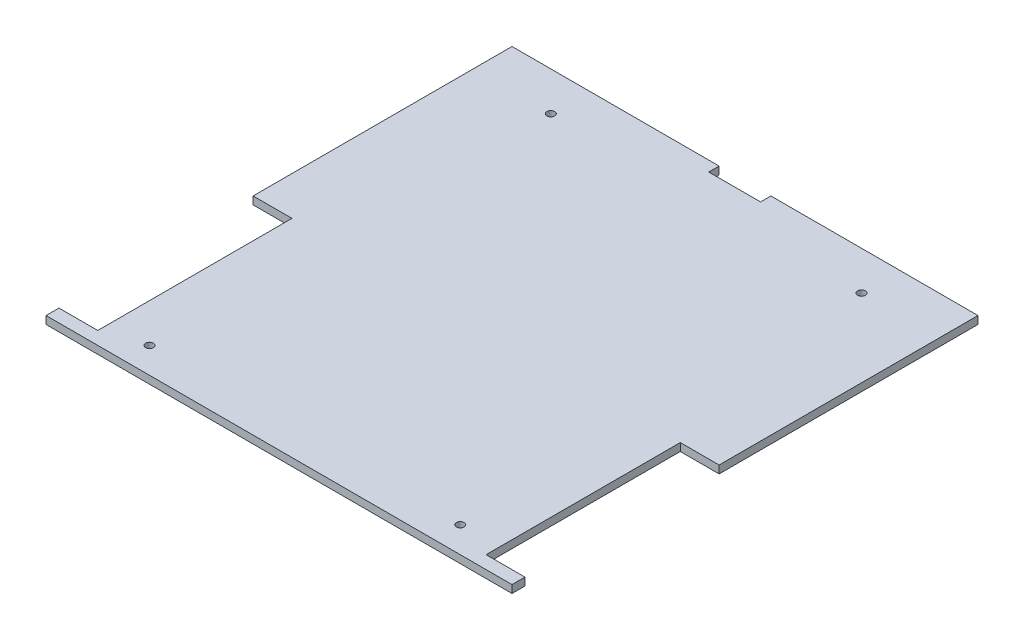
ISO-10303-21;
HEADER;
FILE_DESCRIPTION(('STEP AP214'),'2;1');
FILE_NAME('part.step','',(''),(''),'','','');
FILE_SCHEMA(('AUTOMOTIVE_DESIGN { 1 0 10303 214 1 1 1 1 }'));
ENDSEC;
DATA;
#1=APPLICATION_CONTEXT('core data for automotive mechanical design processes');
#2=APPLICATION_PROTOCOL_DEFINITION('international standard','automotive_design',2000,#1);
#3=PRODUCT_CONTEXT('',#1,'mechanical');
#4=PRODUCT('Part','Part','',(#3));
#5=PRODUCT_RELATED_PRODUCT_CATEGORY('part','',(#4));
#6=PRODUCT_DEFINITION_FORMATION('','',#4);
#7=PRODUCT_DEFINITION_CONTEXT('part definition',#1,'design');
#8=PRODUCT_DEFINITION('design','',#6,#7);
#9=PRODUCT_DEFINITION_SHAPE('','',#8);
#10=(LENGTH_UNIT() NAMED_UNIT(*) SI_UNIT(.MILLI.,.METRE.));
#11=(NAMED_UNIT(*) PLANE_ANGLE_UNIT() SI_UNIT($,.RADIAN.));
#12=(NAMED_UNIT(*) SI_UNIT($,.STERADIAN.) SOLID_ANGLE_UNIT());
#13=UNCERTAINTY_MEASURE_WITH_UNIT(LENGTH_MEASURE(1.E-05),#10,'distance_accuracy_value','');
#14=(GEOMETRIC_REPRESENTATION_CONTEXT(3) GLOBAL_UNCERTAINTY_ASSIGNED_CONTEXT((#13)) GLOBAL_UNIT_ASSIGNED_CONTEXT((#10,
#11,#12)) REPRESENTATION_CONTEXT('',''));
#15=CARTESIAN_POINT('',(0.,0.,0.));
#16=DIRECTION('',(0.,0.,1.));
#17=DIRECTION('',(1.,0.,0.));
#18=AXIS2_PLACEMENT_3D('',#15,#16,#17);
#19=CARTESIAN_POINT('',(-90.,3.,-89.9999999999999));
#20=DIRECTION('',(0.,0.,1.));
#21=DIRECTION('',(1.,0.,0.));
#22=AXIS2_PLACEMENT_3D('',#19,#20,#21);
#23=PLANE('',#22);
#24=DIRECTION('',(-1.,0.,0.));
#25=VECTOR('',#24,1.);
#26=CARTESIAN_POINT('',(-90.,3.,-89.9999999999999));
#27=LINE('',#26,#25);
#28=CARTESIAN_POINT('',(-9.99999999999999,3.,-89.9999999999999));
#29=VERTEX_POINT('',#28);
#30=CARTESIAN_POINT('',(-90.,3.,-89.9999999999999));
#31=VERTEX_POINT('',#30);
#32=EDGE_CURVE('E252',#29,#31,#27,.T.);
#33=ORIENTED_EDGE('',*,*,#32,.F.);
#34=DIRECTION('',(0.,1.,0.));
#35=VECTOR('',#34,1.);
#36=CARTESIAN_POINT('',(-9.99999999999999,-7.,-89.9999999999999));
#37=LINE('',#36,#35);
#38=CARTESIAN_POINT('',(-9.99999999999999,0.,-89.9999999999999));
#39=VERTEX_POINT('',#38);
#40=EDGE_CURVE('E159',#39,#29,#37,.T.);
#41=ORIENTED_EDGE('',*,*,#40,.F.);
#42=DIRECTION('',(-1.,0.,0.));
#43=VECTOR('',#42,1.);
#44=CARTESIAN_POINT('',(-90.,0.,-89.9999999999999));
#45=LINE('',#44,#43);
#46=CARTESIAN_POINT('',(-90.,0.,-89.9999999999999));
#47=VERTEX_POINT('',#46);
#48=EDGE_CURVE('E266',#39,#47,#45,.T.);
#49=ORIENTED_EDGE('',*,*,#48,.T.);
#50=DIRECTION('',(0.,-1.,0.));
#51=VECTOR('',#50,1.);
#52=CARTESIAN_POINT('',(-90.,3.,-89.9999999999999));
#53=LINE('',#52,#51);
#54=EDGE_CURVE('E281',#31,#47,#53,.T.);
#55=ORIENTED_EDGE('',*,*,#54,.F.);
#56=EDGE_LOOP('',(#33,#41,#49,#55));
#57=FACE_BOUND('',#56,.T.);
#58=ADVANCED_FACE('F33',(#57),#23,.F.);
#59=CARTESIAN_POINT('',(90.,3.,-89.9999999999999));
#60=DIRECTION('',(-1.,0.,0.));
#61=DIRECTION('',(0.,0.,1.));
#62=AXIS2_PLACEMENT_3D('',#59,#60,#61);
#63=PLANE('',#62);
#64=DIRECTION('',(0.,0.,-1.));
#65=VECTOR('',#64,1.);
#66=CARTESIAN_POINT('',(90.,0.,-89.9999999999999));
#67=LINE('',#66,#65);
#68=CARTESIAN_POINT('',(90.,0.,90.));
#69=VERTEX_POINT('',#68);
#70=CARTESIAN_POINT('',(90.,0.,85.));
#71=VERTEX_POINT('',#70);
#72=EDGE_CURVE('E263',#69,#71,#67,.T.);
#73=ORIENTED_EDGE('',*,*,#72,.T.);
#74=DIRECTION('',(0.,1.,0.));
#75=VECTOR('',#74,1.);
#76=CARTESIAN_POINT('',(90.,0.,85.));
#77=LINE('',#76,#75);
#78=CARTESIAN_POINT('',(90.,3.,85.));
#79=VERTEX_POINT('',#78);
#80=EDGE_CURVE('E212',#71,#79,#77,.T.);
#81=ORIENTED_EDGE('',*,*,#80,.T.);
#82=DIRECTION('',(0.,0.,-1.));
#83=VECTOR('',#82,1.);
#84=CARTESIAN_POINT('',(90.,3.,-89.9999999999999));
#85=LINE('',#84,#83);
#86=CARTESIAN_POINT('',(90.,3.,90.));
#87=VERTEX_POINT('',#86);
#88=EDGE_CURVE('E249',#87,#79,#85,.T.);
#89=ORIENTED_EDGE('',*,*,#88,.F.);
#90=DIRECTION('',(0.,-1.,0.));
#91=VECTOR('',#90,1.);
#92=CARTESIAN_POINT('',(90.,3.,90.));
#93=LINE('',#92,#91);
#94=EDGE_CURVE('E262',#87,#69,#93,.T.);
#95=ORIENTED_EDGE('',*,*,#94,.T.);
#96=EDGE_LOOP('',(#73,#81,#89,#95));
#97=FACE_BOUND('',#96,.T.);
#98=ADVANCED_FACE('F316',(#97),#63,.F.);
#99=CARTESIAN_POINT('',(-90.,3.,-89.9999999999999));
#100=DIRECTION('',(1.,0.,0.));
#101=DIRECTION('',(0.,0.,-1.));
#102=AXIS2_PLACEMENT_3D('',#99,#100,#101);
#103=PLANE('',#102);
#104=DIRECTION('',(0.,0.,1.));
#105=VECTOR('',#104,1.);
#106=CARTESIAN_POINT('',(-90.,0.,-89.9999999999999));
#107=LINE('',#106,#105);
#108=CARTESIAN_POINT('',(-90.,0.,10.));
#109=VERTEX_POINT('',#108);
#110=EDGE_CURVE('E271',#47,#109,#107,.T.);
#111=ORIENTED_EDGE('',*,*,#110,.T.);
#112=DIRECTION('',(0.,1.,0.));
#113=VECTOR('',#112,1.);
#114=CARTESIAN_POINT('',(-90.,0.,10.));
#115=LINE('',#114,#113);
#116=CARTESIAN_POINT('',(-90.,3.,10.));
#117=VERTEX_POINT('',#116);
#118=EDGE_CURVE('E216',#109,#117,#115,.T.);
#119=ORIENTED_EDGE('',*,*,#118,.T.);
#120=DIRECTION('',(0.,0.,1.));
#121=VECTOR('',#120,1.);
#122=CARTESIAN_POINT('',(-90.,3.,-89.9999999999999));
#123=LINE('',#122,#121);
#124=EDGE_CURVE('E257',#31,#117,#123,.T.);
#125=ORIENTED_EDGE('',*,*,#124,.F.);
#126=ORIENTED_EDGE('',*,*,#54,.T.);
#127=EDGE_LOOP('',(#111,#119,#125,#126));
#128=FACE_BOUND('',#127,.T.);
#129=ADVANCED_FACE('F339',(#128),#103,.F.);
#130=CARTESIAN_POINT('',(90.,3.,10.));
#131=VERTEX_POINT('',#130);
#132=CARTESIAN_POINT('',(90.,3.,-89.9999999999999));
#133=VERTEX_POINT('',#132);
#134=EDGE_CURVE('E253',#131,#133,#85,.T.);
#135=ORIENTED_EDGE('',*,*,#134,.F.);
#136=DIRECTION('',(0.,1.,0.));
#137=VECTOR('',#136,1.);
#138=CARTESIAN_POINT('',(90.,0.,10.));
#139=LINE('',#138,#137);
#140=CARTESIAN_POINT('',(90.,0.,10.));
#141=VERTEX_POINT('',#140);
#142=EDGE_CURVE('E235',#141,#131,#139,.T.);
#143=ORIENTED_EDGE('',*,*,#142,.F.);
#144=CARTESIAN_POINT('',(90.,0.,-89.9999999999999));
#145=VERTEX_POINT('',#144);
#146=EDGE_CURVE('E219',#141,#145,#67,.T.);
#147=ORIENTED_EDGE('',*,*,#146,.T.);
#148=DIRECTION('',(0.,-1.,0.));
#149=VECTOR('',#148,1.);
#150=CARTESIAN_POINT('',(90.,3.,-89.9999999999999));
#151=LINE('',#150,#149);
#152=EDGE_CURVE('E284',#133,#145,#151,.T.);
#153=ORIENTED_EDGE('',*,*,#152,.F.);
#154=EDGE_LOOP('',(#135,#143,#147,#153));
#155=FACE_BOUND('',#154,.T.);
#156=ADVANCED_FACE('F35',(#155),#63,.F.);
#157=CARTESIAN_POINT('',(10.,0.,-89.9999999999999));
#158=VERTEX_POINT('',#157);
#159=EDGE_CURVE('E267',#145,#158,#45,.T.);
#160=ORIENTED_EDGE('',*,*,#159,.T.);
#161=DIRECTION('',(0.,1.,0.));
#162=VECTOR('',#161,1.);
#163=CARTESIAN_POINT('',(10.,-7.,-89.9999999999999));
#164=LINE('',#163,#162);
#165=CARTESIAN_POINT('',(10.,3.,-89.9999999999999));
#166=VERTEX_POINT('',#165);
#167=EDGE_CURVE('E171',#158,#166,#164,.T.);
#168=ORIENTED_EDGE('',*,*,#167,.T.);
#169=EDGE_CURVE('E254',#133,#166,#27,.T.);
#170=ORIENTED_EDGE('',*,*,#169,.F.);
#171=ORIENTED_EDGE('',*,*,#152,.T.);
#172=EDGE_LOOP('',(#160,#168,#170,#171));
#173=FACE_BOUND('',#172,.T.);
#174=ADVANCED_FACE('F296',(#173),#23,.F.);
#175=CARTESIAN_POINT('',(-90.,3.,85.));
#176=VERTEX_POINT('',#175);
#177=CARTESIAN_POINT('',(-90.,3.,90.));
#178=VERTEX_POINT('',#177);
#179=EDGE_CURVE('E256',#176,#178,#123,.T.);
#180=ORIENTED_EDGE('',*,*,#179,.F.);
#181=DIRECTION('',(0.,1.,0.));
#182=VECTOR('',#181,1.);
#183=CARTESIAN_POINT('',(-90.,0.,85.));
#184=LINE('',#183,#182);
#185=CARTESIAN_POINT('',(-90.,0.,85.));
#186=VERTEX_POINT('',#185);
#187=EDGE_CURVE('E207',#186,#176,#184,.T.);
#188=ORIENTED_EDGE('',*,*,#187,.F.);
#189=CARTESIAN_POINT('',(-90.,0.,90.));
#190=VERTEX_POINT('',#189);
#191=EDGE_CURVE('E270',#186,#190,#107,.T.);
#192=ORIENTED_EDGE('',*,*,#191,.T.);
#193=DIRECTION('',(0.,-1.,0.));
#194=VECTOR('',#193,1.);
#195=CARTESIAN_POINT('',(-90.,3.,90.));
#196=LINE('',#195,#194);
#197=EDGE_CURVE('E278',#178,#190,#196,.T.);
#198=ORIENTED_EDGE('',*,*,#197,.F.);
#199=EDGE_LOOP('',(#180,#188,#192,#198));
#200=FACE_BOUND('',#199,.T.);
#201=ADVANCED_FACE('F327',(#200),#103,.F.);
#202=CARTESIAN_POINT('',(-90.,3.,90.));
#203=DIRECTION('',(0.,0.,-1.));
#204=DIRECTION('',(-1.,0.,0.));
#205=AXIS2_PLACEMENT_3D('',#202,#203,#204);
#206=PLANE('',#205);
#207=DIRECTION('',(1.,0.,0.));
#208=VECTOR('',#207,1.);
#209=CARTESIAN_POINT('',(-90.,0.,90.));
#210=LINE('',#209,#208);
#211=EDGE_CURVE('E274',#190,#69,#210,.T.);
#212=ORIENTED_EDGE('',*,*,#211,.T.);
#213=ORIENTED_EDGE('',*,*,#94,.F.);
#214=DIRECTION('',(1.,0.,0.));
#215=VECTOR('',#214,1.);
#216=CARTESIAN_POINT('',(-90.,3.,90.));
#217=LINE('',#216,#215);
#218=EDGE_CURVE('E260',#178,#87,#217,.T.);
#219=ORIENTED_EDGE('',*,*,#218,.F.);
#220=ORIENTED_EDGE('',*,*,#197,.T.);
#221=EDGE_LOOP('',(#212,#213,#219,#220));
#222=FACE_BOUND('',#221,.T.);
#223=ADVANCED_FACE('F321',(#222),#206,.F.);
#224=CARTESIAN_POINT('',(0.,3.,0.));
#225=DIRECTION('',(0.,1.,0.));
#226=DIRECTION('',(0.,0.,1.));
#227=AXIS2_PLACEMENT_3D('',#224,#225,#226);
#228=PLANE('',#227);
#229=DIRECTION('',(0.,0.,1.));
#230=VECTOR('',#229,1.);
#231=CARTESIAN_POINT('',(-9.99999999999999,3.,-89.9999999999999));
#232=LINE('',#231,#230);
#233=CARTESIAN_POINT('',(-9.99999999999999,3.,-85.9999999999999));
#234=VERTEX_POINT('',#233);
#235=EDGE_CURVE('E156',#29,#234,#232,.T.);
#236=ORIENTED_EDGE('',*,*,#235,.F.);
#237=ORIENTED_EDGE('',*,*,#32,.T.);
#238=ORIENTED_EDGE('',*,*,#124,.T.);
#239=DIRECTION('',(-1.,0.,0.));
#240=VECTOR('',#239,1.);
#241=CARTESIAN_POINT('',(-90.,3.,10.));
#242=LINE('',#241,#240);
#243=CARTESIAN_POINT('',(-75.,3.,10.));
#244=VERTEX_POINT('',#243);
#245=EDGE_CURVE('E202',#244,#117,#242,.T.);
#246=ORIENTED_EDGE('',*,*,#245,.F.);
#247=DIRECTION('',(0.,0.,-1.));
#248=VECTOR('',#247,1.);
#249=CARTESIAN_POINT('',(-75.,3.,10.));
#250=LINE('',#249,#248);
#251=CARTESIAN_POINT('',(-75.,3.,85.));
#252=VERTEX_POINT('',#251);
#253=EDGE_CURVE('E211',#252,#244,#250,.T.);
#254=ORIENTED_EDGE('',*,*,#253,.F.);
#255=DIRECTION('',(1.,0.,0.));
#256=VECTOR('',#255,1.);
#257=CARTESIAN_POINT('',(-90.,3.,85.));
#258=LINE('',#257,#256);
#259=EDGE_CURVE('E208',#176,#252,#258,.T.);
#260=ORIENTED_EDGE('',*,*,#259,.F.);
#261=ORIENTED_EDGE('',*,*,#179,.T.);
#262=ORIENTED_EDGE('',*,*,#218,.T.);
#263=ORIENTED_EDGE('',*,*,#88,.T.);
#264=DIRECTION('',(1.,0.,0.));
#265=VECTOR('',#264,1.);
#266=CARTESIAN_POINT('',(90.,3.,85.));
#267=LINE('',#266,#265);
#268=CARTESIAN_POINT('',(75.,3.,85.));
#269=VERTEX_POINT('',#268);
#270=EDGE_CURVE('E229',#269,#79,#267,.T.);
#271=ORIENTED_EDGE('',*,*,#270,.F.);
#272=DIRECTION('',(0.,0.,1.));
#273=VECTOR('',#272,1.);
#274=CARTESIAN_POINT('',(75.,3.,10.));
#275=LINE('',#274,#273);
#276=CARTESIAN_POINT('',(75.,3.,10.));
#277=VERTEX_POINT('',#276);
#278=EDGE_CURVE('E238',#277,#269,#275,.T.);
#279=ORIENTED_EDGE('',*,*,#278,.F.);
#280=DIRECTION('',(-1.,0.,0.));
#281=VECTOR('',#280,1.);
#282=CARTESIAN_POINT('',(90.,3.,10.));
#283=LINE('',#282,#281);
#284=EDGE_CURVE('E196',#131,#277,#283,.T.);
#285=ORIENTED_EDGE('',*,*,#284,.F.);
#286=ORIENTED_EDGE('',*,*,#134,.T.);
#287=ORIENTED_EDGE('',*,*,#169,.T.);
#288=DIRECTION('',(0.,0.,-1.));
#289=VECTOR('',#288,1.);
#290=CARTESIAN_POINT('',(10.,3.,-89.9999999999999));
#291=LINE('',#290,#289);
#292=CARTESIAN_POINT('',(10.,3.,-85.9999999999999));
#293=VERTEX_POINT('',#292);
#294=EDGE_CURVE('E153',#293,#166,#291,.T.);
#295=ORIENTED_EDGE('',*,*,#294,.F.);
#296=DIRECTION('',(1.,0.,0.));
#297=VECTOR('',#296,1.);
#298=CARTESIAN_POINT('',(-9.99999999999999,3.,-85.9999999999999));
#299=LINE('',#298,#297);
#300=EDGE_CURVE('E148',#234,#293,#299,.T.);
#301=ORIENTED_EDGE('',*,*,#300,.F.);
#302=EDGE_LOOP('',(#236,#237,#238,#246,#254,#260,#261,#262,#263,#271,#279,#285,#286,#287,#295,#301));
#303=FACE_BOUND('',#302,.T.);
#304=CARTESIAN_POINT('',(60.,3.,80.));
#305=DIRECTION('',(0.,1.,0.));
#306=DIRECTION('',(0.,0.,-1.));
#307=AXIS2_PLACEMENT_3D('',#304,#305,#306);
#308=CIRCLE('',#307,1.5);
#309=CARTESIAN_POINT('',(60.,3.,78.5));
#310=VERTEX_POINT('',#309);
#311=EDGE_CURVE('E185',#310,#310,#308,.T.);
#312=ORIENTED_EDGE('',*,*,#311,.F.);
#313=EDGE_LOOP('',(#312));
#314=FACE_BOUND('',#313,.T.);
#315=CARTESIAN_POINT('',(-60.,3.,-74.9999999999999));
#316=DIRECTION('',(0.,1.,0.));
#317=DIRECTION('',(0.,0.,1.));
#318=AXIS2_PLACEMENT_3D('',#315,#316,#317);
#319=CIRCLE('',#318,1.5);
#320=CARTESIAN_POINT('',(-60.,3.,-73.4999999999999));
#321=VERTEX_POINT('',#320);
#322=EDGE_CURVE('E178',#321,#321,#319,.T.);
#323=ORIENTED_EDGE('',*,*,#322,.F.);
#324=EDGE_LOOP('',(#323));
#325=FACE_BOUND('',#324,.T.);
#326=CARTESIAN_POINT('',(60.,3.,-74.9999999999999));
#327=DIRECTION('',(0.,1.,0.));
#328=DIRECTION('',(0.,0.,-1.));
#329=AXIS2_PLACEMENT_3D('',#326,#327,#328);
#330=CIRCLE('',#329,1.5);
#331=CARTESIAN_POINT('',(60.,3.,-76.4999999999999));
#332=VERTEX_POINT('',#331);
#333=EDGE_CURVE('E170',#332,#332,#330,.T.);
#334=ORIENTED_EDGE('',*,*,#333,.F.);
#335=EDGE_LOOP('',(#334));
#336=FACE_BOUND('',#335,.T.);
#337=CARTESIAN_POINT('',(-60.,3.,80.));
#338=DIRECTION('',(0.,1.,0.));
#339=DIRECTION('',(0.,0.,1.));
#340=AXIS2_PLACEMENT_3D('',#337,#338,#339);
#341=CIRCLE('',#340,1.5);
#342=CARTESIAN_POINT('',(-60.,3.,81.5));
#343=VERTEX_POINT('',#342);
#344=EDGE_CURVE('E184',#343,#343,#341,.T.);
#345=ORIENTED_EDGE('',*,*,#344,.F.);
#346=EDGE_LOOP('',(#345));
#347=FACE_BOUND('',#346,.T.);
#348=ADVANCED_FACE('F163',(#303,#314,#325,#336,#347),#228,.T.);
#349=CARTESIAN_POINT('',(0.,0.,0.));
#350=DIRECTION('',(0.,1.,0.));
#351=DIRECTION('',(0.,0.,1.));
#352=AXIS2_PLACEMENT_3D('',#349,#350,#351);
#353=PLANE('',#352);
#354=ORIENTED_EDGE('',*,*,#48,.F.);
#355=DIRECTION('',(0.,0.,1.));
#356=VECTOR('',#355,1.);
#357=CARTESIAN_POINT('',(-9.99999999999996,0.,0.));
#358=LINE('',#357,#356);
#359=CARTESIAN_POINT('',(-9.99999999999999,0.,-85.9999999999999));
#360=VERTEX_POINT('',#359);
#361=EDGE_CURVE('E11',#39,#360,#358,.T.);
#362=ORIENTED_EDGE('',*,*,#361,.T.);
#363=DIRECTION('',(1.,0.,0.));
#364=VECTOR('',#363,1.);
#365=CARTESIAN_POINT('',(0.,0.,-85.9999999999999));
#366=LINE('',#365,#364);
#367=CARTESIAN_POINT('',(10.,0.,-85.9999999999999));
#368=VERTEX_POINT('',#367);
#369=EDGE_CURVE('E151',#360,#368,#366,.T.);
#370=ORIENTED_EDGE('',*,*,#369,.T.);
#371=DIRECTION('',(0.,0.,-1.));
#372=VECTOR('',#371,1.);
#373=CARTESIAN_POINT('',(10.,0.,0.));
#374=LINE('',#373,#372);
#375=EDGE_CURVE('E41',#368,#158,#374,.T.);
#376=ORIENTED_EDGE('',*,*,#375,.T.);
#377=ORIENTED_EDGE('',*,*,#159,.F.);
#378=ORIENTED_EDGE('',*,*,#146,.F.);
#379=DIRECTION('',(-1.,0.,0.));
#380=VECTOR('',#379,1.);
#381=CARTESIAN_POINT('',(90.,0.,10.));
#382=LINE('',#381,#380);
#383=CARTESIAN_POINT('',(75.,0.,10.));
#384=VERTEX_POINT('',#383);
#385=EDGE_CURVE('E225',#141,#384,#382,.T.);
#386=ORIENTED_EDGE('',*,*,#385,.T.);
#387=DIRECTION('',(0.,0.,1.));
#388=VECTOR('',#387,1.);
#389=CARTESIAN_POINT('',(75.,0.,10.));
#390=LINE('',#389,#388);
#391=CARTESIAN_POINT('',(75.,0.,85.));
#392=VERTEX_POINT('',#391);
#393=EDGE_CURVE('E228',#384,#392,#390,.T.);
#394=ORIENTED_EDGE('',*,*,#393,.T.);
#395=DIRECTION('',(1.,0.,0.));
#396=VECTOR('',#395,1.);
#397=CARTESIAN_POINT('',(90.,0.,85.));
#398=LINE('',#397,#396);
#399=EDGE_CURVE('E232',#392,#71,#398,.T.);
#400=ORIENTED_EDGE('',*,*,#399,.T.);
#401=ORIENTED_EDGE('',*,*,#72,.F.);
#402=ORIENTED_EDGE('',*,*,#211,.F.);
#403=ORIENTED_EDGE('',*,*,#191,.F.);
#404=DIRECTION('',(1.,0.,0.));
#405=VECTOR('',#404,1.);
#406=CARTESIAN_POINT('',(-90.,0.,85.));
#407=LINE('',#406,#405);
#408=CARTESIAN_POINT('',(-75.,0.,85.));
#409=VERTEX_POINT('',#408);
#410=EDGE_CURVE('E199',#186,#409,#407,.T.);
#411=ORIENTED_EDGE('',*,*,#410,.T.);
#412=DIRECTION('',(0.,0.,-1.));
#413=VECTOR('',#412,1.);
#414=CARTESIAN_POINT('',(-75.,0.,10.));
#415=LINE('',#414,#413);
#416=CARTESIAN_POINT('',(-75.,0.,10.));
#417=VERTEX_POINT('',#416);
#418=EDGE_CURVE('E56',#409,#417,#415,.T.);
#419=ORIENTED_EDGE('',*,*,#418,.T.);
#420=DIRECTION('',(-1.,0.,0.));
#421=VECTOR('',#420,1.);
#422=CARTESIAN_POINT('',(-90.,0.,10.));
#423=LINE('',#422,#421);
#424=EDGE_CURVE('E204',#417,#109,#423,.T.);
#425=ORIENTED_EDGE('',*,*,#424,.T.);
#426=ORIENTED_EDGE('',*,*,#110,.F.);
#427=EDGE_LOOP('',(#354,#362,#370,#376,#377,#378,#386,#394,#400,#401,#402,#403,#411,#419,#425,#426));
#428=FACE_BOUND('',#427,.T.);
#429=CARTESIAN_POINT('',(60.,0.,80.));
#430=DIRECTION('',(0.,1.,0.));
#431=DIRECTION('',(0.,0.,-1.));
#432=AXIS2_PLACEMENT_3D('',#429,#430,#431);
#433=CIRCLE('',#432,1.5);
#434=CARTESIAN_POINT('',(60.,0.,78.5));
#435=VERTEX_POINT('',#434);
#436=EDGE_CURVE('E181',#435,#435,#433,.T.);
#437=ORIENTED_EDGE('',*,*,#436,.T.);
#438=EDGE_LOOP('',(#437));
#439=FACE_BOUND('',#438,.T.);
#440=CARTESIAN_POINT('',(-60.,0.,-74.9999999999999));
#441=DIRECTION('',(0.,1.,0.));
#442=DIRECTION('',(0.,0.,1.));
#443=AXIS2_PLACEMENT_3D('',#440,#441,#442);
#444=CIRCLE('',#443,1.5);
#445=CARTESIAN_POINT('',(-60.,0.,-73.4999999999999));
#446=VERTEX_POINT('',#445);
#447=EDGE_CURVE('E188',#446,#446,#444,.T.);
#448=ORIENTED_EDGE('',*,*,#447,.T.);
#449=EDGE_LOOP('',(#448));
#450=FACE_BOUND('',#449,.T.);
#451=CARTESIAN_POINT('',(60.,0.,-74.9999999999999));
#452=DIRECTION('',(0.,1.,0.));
#453=DIRECTION('',(0.,0.,-1.));
#454=AXIS2_PLACEMENT_3D('',#451,#452,#453);
#455=CIRCLE('',#454,1.5);
#456=CARTESIAN_POINT('',(60.,0.,-76.4999999999999));
#457=VERTEX_POINT('',#456);
#458=EDGE_CURVE('E175',#457,#457,#455,.T.);
#459=ORIENTED_EDGE('',*,*,#458,.T.);
#460=EDGE_LOOP('',(#459));
#461=FACE_BOUND('',#460,.T.);
#462=CARTESIAN_POINT('',(-60.,0.,80.));
#463=DIRECTION('',(0.,1.,0.));
#464=DIRECTION('',(0.,0.,1.));
#465=AXIS2_PLACEMENT_3D('',#462,#463,#464);
#466=CIRCLE('',#465,1.5);
#467=CARTESIAN_POINT('',(-60.,0.,81.5));
#468=VERTEX_POINT('',#467);
#469=EDGE_CURVE('E193',#468,#468,#466,.T.);
#470=ORIENTED_EDGE('',*,*,#469,.T.);
#471=EDGE_LOOP('',(#470));
#472=FACE_BOUND('',#471,.T.);
#473=ADVANCED_FACE('F291',(#428,#439,#450,#461,#472),#353,.F.);
#474=CARTESIAN_POINT('',(90.,0.,85.));
#475=DIRECTION('',(0.,0.,1.));
#476=DIRECTION('',(1.,0.,0.));
#477=AXIS2_PLACEMENT_3D('',#474,#475,#476);
#478=PLANE('',#477);
#479=ORIENTED_EDGE('',*,*,#270,.T.);
#480=ORIENTED_EDGE('',*,*,#80,.F.);
#481=ORIENTED_EDGE('',*,*,#399,.F.);
#482=DIRECTION('',(0.,1.,0.));
#483=VECTOR('',#482,1.);
#484=CARTESIAN_POINT('',(75.,0.,85.));
#485=LINE('',#484,#483);
#486=EDGE_CURVE('E244',#392,#269,#485,.T.);
#487=ORIENTED_EDGE('',*,*,#486,.T.);
#488=EDGE_LOOP('',(#479,#480,#481,#487));
#489=FACE_BOUND('',#488,.T.);
#490=ADVANCED_FACE('F312',(#489),#478,.F.);
#491=CARTESIAN_POINT('',(75.,0.,10.));
#492=DIRECTION('',(-1.,0.,0.));
#493=DIRECTION('',(0.,0.,1.));
#494=AXIS2_PLACEMENT_3D('',#491,#492,#493);
#495=PLANE('',#494);
#496=ORIENTED_EDGE('',*,*,#278,.T.);
#497=ORIENTED_EDGE('',*,*,#486,.F.);
#498=ORIENTED_EDGE('',*,*,#393,.F.);
#499=DIRECTION('',(0.,1.,0.));
#500=VECTOR('',#499,1.);
#501=CARTESIAN_POINT('',(75.,0.,10.));
#502=LINE('',#501,#500);
#503=EDGE_CURVE('E246',#384,#277,#502,.T.);
#504=ORIENTED_EDGE('',*,*,#503,.T.);
#505=EDGE_LOOP('',(#496,#497,#498,#504));
#506=FACE_BOUND('',#505,.T.);
#507=ADVANCED_FACE('F308',(#506),#495,.F.);
#508=CARTESIAN_POINT('',(90.,0.,10.));
#509=DIRECTION('',(0.,0.,-1.));
#510=DIRECTION('',(-1.,0.,0.));
#511=AXIS2_PLACEMENT_3D('',#508,#509,#510);
#512=PLANE('',#511);
#513=ORIENTED_EDGE('',*,*,#284,.T.);
#514=ORIENTED_EDGE('',*,*,#503,.F.);
#515=ORIENTED_EDGE('',*,*,#385,.F.);
#516=ORIENTED_EDGE('',*,*,#142,.T.);
#517=EDGE_LOOP('',(#513,#514,#515,#516));
#518=FACE_BOUND('',#517,.T.);
#519=ADVANCED_FACE('F304',(#518),#512,.F.);
#520=CARTESIAN_POINT('',(-90.,0.,10.));
#521=DIRECTION('',(0.,0.,-1.));
#522=DIRECTION('',(-1.,0.,0.));
#523=AXIS2_PLACEMENT_3D('',#520,#521,#522);
#524=PLANE('',#523);
#525=ORIENTED_EDGE('',*,*,#245,.T.);
#526=ORIENTED_EDGE('',*,*,#118,.F.);
#527=ORIENTED_EDGE('',*,*,#424,.F.);
#528=DIRECTION('',(0.,1.,0.));
#529=VECTOR('',#528,1.);
#530=CARTESIAN_POINT('',(-75.,0.,10.));
#531=LINE('',#530,#529);
#532=EDGE_CURVE('E220',#417,#244,#531,.T.);
#533=ORIENTED_EDGE('',*,*,#532,.T.);
#534=EDGE_LOOP('',(#525,#526,#527,#533));
#535=FACE_BOUND('',#534,.T.);
#536=ADVANCED_FACE('F336',(#535),#524,.F.);
#537=CARTESIAN_POINT('',(-75.,0.,10.));
#538=DIRECTION('',(1.,0.,0.));
#539=DIRECTION('',(0.,0.,-1.));
#540=AXIS2_PLACEMENT_3D('',#537,#538,#539);
#541=PLANE('',#540);
#542=ORIENTED_EDGE('',*,*,#253,.T.);
#543=ORIENTED_EDGE('',*,*,#532,.F.);
#544=ORIENTED_EDGE('',*,*,#418,.F.);
#545=DIRECTION('',(0.,1.,0.));
#546=VECTOR('',#545,1.);
#547=CARTESIAN_POINT('',(-75.,0.,85.));
#548=LINE('',#547,#546);
#549=EDGE_CURVE('E222',#409,#252,#548,.T.);
#550=ORIENTED_EDGE('',*,*,#549,.T.);
#551=EDGE_LOOP('',(#542,#543,#544,#550));
#552=FACE_BOUND('',#551,.T.);
#553=ADVANCED_FACE('F333',(#552),#541,.F.);
#554=CARTESIAN_POINT('',(-90.,0.,85.));
#555=DIRECTION('',(0.,0.,1.));
#556=DIRECTION('',(1.,0.,0.));
#557=AXIS2_PLACEMENT_3D('',#554,#555,#556);
#558=PLANE('',#557);
#559=ORIENTED_EDGE('',*,*,#259,.T.);
#560=ORIENTED_EDGE('',*,*,#549,.F.);
#561=ORIENTED_EDGE('',*,*,#410,.F.);
#562=ORIENTED_EDGE('',*,*,#187,.T.);
#563=EDGE_LOOP('',(#559,#560,#561,#562));
#564=FACE_BOUND('',#563,.T.);
#565=ADVANCED_FACE('F330',(#564),#558,.F.);
#566=CARTESIAN_POINT('',(-60.,0.,80.));
#567=DIRECTION('',(0.,1.,0.));
#568=DIRECTION('',(0.,0.,1.));
#569=AXIS2_PLACEMENT_3D('',#566,#567,#568);
#570=CYLINDRICAL_SURFACE('',#569,1.5);
#571=ORIENTED_EDGE('',*,*,#469,.F.);
#572=EDGE_LOOP('',(#571));
#573=FACE_BOUND('',#572,.T.);
#574=ORIENTED_EDGE('',*,*,#344,.T.);
#575=EDGE_LOOP('',(#574));
#576=FACE_BOUND('',#575,.T.);
#577=ADVANCED_FACE('F373',(#573,#576),#570,.F.);
#578=CARTESIAN_POINT('',(60.,0.,-74.9999999999999));
#579=DIRECTION('',(0.,1.,0.));
#580=DIRECTION('',(0.,0.,1.));
#581=AXIS2_PLACEMENT_3D('',#578,#579,#580);
#582=CYLINDRICAL_SURFACE('',#581,1.5);
#583=ORIENTED_EDGE('',*,*,#458,.F.);
#584=EDGE_LOOP('',(#583));
#585=FACE_BOUND('',#584,.T.);
#586=ORIENTED_EDGE('',*,*,#333,.T.);
#587=EDGE_LOOP('',(#586));
#588=FACE_BOUND('',#587,.T.);
#589=ADVANCED_FACE('F380',(#585,#588),#582,.F.);
#590=CARTESIAN_POINT('',(-60.,0.,-74.9999999999999));
#591=DIRECTION('',(0.,1.,0.));
#592=DIRECTION('',(0.,0.,1.));
#593=AXIS2_PLACEMENT_3D('',#590,#591,#592);
#594=CYLINDRICAL_SURFACE('',#593,1.5);
#595=ORIENTED_EDGE('',*,*,#447,.F.);
#596=EDGE_LOOP('',(#595));
#597=FACE_BOUND('',#596,.T.);
#598=ORIENTED_EDGE('',*,*,#322,.T.);
#599=EDGE_LOOP('',(#598));
#600=FACE_BOUND('',#599,.T.);
#601=ADVANCED_FACE('F382',(#597,#600),#594,.F.);
#602=CARTESIAN_POINT('',(60.,0.,80.));
#603=DIRECTION('',(0.,1.,0.));
#604=DIRECTION('',(0.,0.,1.));
#605=AXIS2_PLACEMENT_3D('',#602,#603,#604);
#606=CYLINDRICAL_SURFACE('',#605,1.5);
#607=ORIENTED_EDGE('',*,*,#436,.F.);
#608=EDGE_LOOP('',(#607));
#609=FACE_BOUND('',#608,.T.);
#610=ORIENTED_EDGE('',*,*,#311,.T.);
#611=EDGE_LOOP('',(#610));
#612=FACE_BOUND('',#611,.T.);
#613=ADVANCED_FACE('F385',(#609,#612),#606,.F.);
#614=CARTESIAN_POINT('',(-9.99999999999999,-7.,-89.9999999999999));
#615=DIRECTION('',(-1.,0.,0.));
#616=DIRECTION('',(0.,0.,1.));
#617=AXIS2_PLACEMENT_3D('',#614,#615,#616);
#618=PLANE('',#617);
#619=ORIENTED_EDGE('',*,*,#40,.T.);
#620=ORIENTED_EDGE('',*,*,#235,.T.);
#621=DIRECTION('',(0.,1.,0.));
#622=VECTOR('',#621,1.);
#623=CARTESIAN_POINT('',(-9.99999999999999,-7.,-85.9999999999999));
#624=LINE('',#623,#622);
#625=EDGE_CURVE('E144',#360,#234,#624,.T.);
#626=ORIENTED_EDGE('',*,*,#625,.F.);
#627=ORIENTED_EDGE('',*,*,#361,.F.);
#628=EDGE_LOOP('',(#619,#620,#626,#627));
#629=FACE_BOUND('',#628,.T.);
#630=ADVANCED_FACE('F157',(#629),#618,.F.);
#631=CARTESIAN_POINT('',(10.,-7.,-89.9999999999999));
#632=DIRECTION('',(1.,0.,0.));
#633=DIRECTION('',(0.,0.,-1.));
#634=AXIS2_PLACEMENT_3D('',#631,#632,#633);
#635=PLANE('',#634);
#636=DIRECTION('',(0.,1.,0.));
#637=VECTOR('',#636,1.);
#638=CARTESIAN_POINT('',(10.,-7.,-85.9999999999999));
#639=LINE('',#638,#637);
#640=EDGE_CURVE('E48',#368,#293,#639,.T.);
#641=ORIENTED_EDGE('',*,*,#640,.T.);
#642=ORIENTED_EDGE('',*,*,#294,.T.);
#643=ORIENTED_EDGE('',*,*,#167,.F.);
#644=ORIENTED_EDGE('',*,*,#375,.F.);
#645=EDGE_LOOP('',(#641,#642,#643,#644));
#646=FACE_BOUND('',#645,.T.);
#647=ADVANCED_FACE('F395',(#646),#635,.F.);
#648=CARTESIAN_POINT('',(-9.99999999999999,-7.,-85.9999999999999));
#649=DIRECTION('',(0.,0.,1.));
#650=DIRECTION('',(1.,0.,0.));
#651=AXIS2_PLACEMENT_3D('',#648,#649,#650);
#652=PLANE('',#651);
#653=ORIENTED_EDGE('',*,*,#625,.T.);
#654=ORIENTED_EDGE('',*,*,#300,.T.);
#655=ORIENTED_EDGE('',*,*,#640,.F.);
#656=ORIENTED_EDGE('',*,*,#369,.F.);
#657=EDGE_LOOP('',(#653,#654,#655,#656));
#658=FACE_BOUND('',#657,.T.);
#659=ADVANCED_FACE('F146',(#658),#652,.F.);
#660=CLOSED_SHELL('',(#58,#98,#129,#156,#174,#201,#223,#348,#473,#490,#507,#519,#536,#553,#565,
#577,#589,#601,#613,#630,#647,#659));
#661=MANIFOLD_SOLID_BREP('B2',#660);
#662=ADVANCED_BREP_SHAPE_REPRESENTATION('',(#18,#661),#14);
#663=SHAPE_DEFINITION_REPRESENTATION(#9,#662);
ENDSEC;
END-ISO-10303-21;
